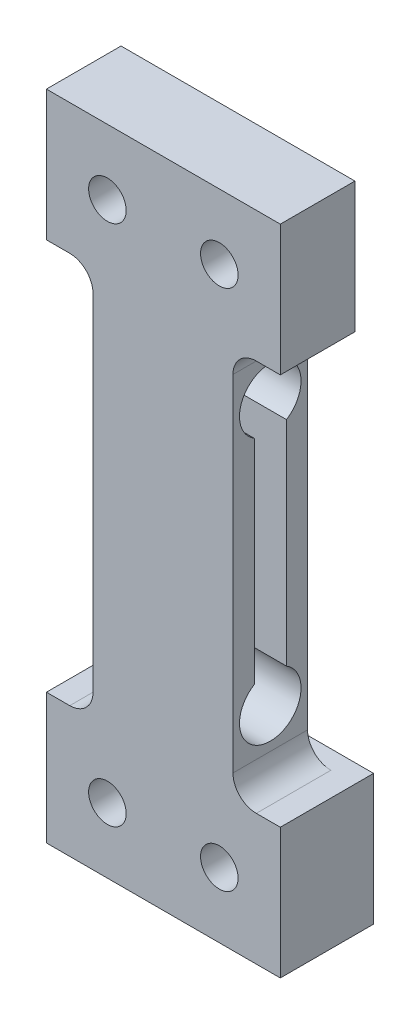
ISO-10303-21;
HEADER;
FILE_DESCRIPTION(('STEP AP214'),'2;1');
FILE_NAME('part.step','',(''),(''),'','','');
FILE_SCHEMA(('AUTOMOTIVE_DESIGN { 1 0 10303 214 1 1 1 1 }'));
ENDSEC;
DATA;
#1=APPLICATION_CONTEXT('core data for automotive mechanical design processes');
#2=APPLICATION_PROTOCOL_DEFINITION('international standard','automotive_design',2000,#1);
#3=PRODUCT_CONTEXT('',#1,'mechanical');
#4=PRODUCT('Part','Part','',(#3));
#5=PRODUCT_RELATED_PRODUCT_CATEGORY('part','',(#4));
#6=PRODUCT_DEFINITION_FORMATION('','',#4);
#7=PRODUCT_DEFINITION_CONTEXT('part definition',#1,'design');
#8=PRODUCT_DEFINITION('design','',#6,#7);
#9=PRODUCT_DEFINITION_SHAPE('','',#8);
#10=(LENGTH_UNIT() NAMED_UNIT(*) SI_UNIT(.MILLI.,.METRE.));
#11=(NAMED_UNIT(*) PLANE_ANGLE_UNIT() SI_UNIT($,.RADIAN.));
#12=(NAMED_UNIT(*) SI_UNIT($,.STERADIAN.) SOLID_ANGLE_UNIT());
#13=UNCERTAINTY_MEASURE_WITH_UNIT(LENGTH_MEASURE(1.E-05),#10,'distance_accuracy_value','');
#14=(GEOMETRIC_REPRESENTATION_CONTEXT(3) GLOBAL_UNCERTAINTY_ASSIGNED_CONTEXT((#13)) GLOBAL_UNIT_ASSIGNED_CONTEXT((#10,
#11,#12)) REPRESENTATION_CONTEXT('',''));
#15=CARTESIAN_POINT('',(0.,0.,0.));
#16=DIRECTION('',(0.,0.,1.));
#17=DIRECTION('',(1.,0.,0.));
#18=AXIS2_PLACEMENT_3D('',#15,#16,#17);
#19=CARTESIAN_POINT('',(-10.,0.,4.));
#20=DIRECTION('',(-1.,0.,0.));
#21=DIRECTION('',(0.,0.,1.));
#22=AXIS2_PLACEMENT_3D('',#19,#20,#21);
#23=PLANE('',#22);
#24=DIRECTION('',(0.,0.,1.));
#25=VECTOR('',#24,1.);
#26=CARTESIAN_POINT('',(-10.,28.,0.));
#27=LINE('',#26,#25);
#28=CARTESIAN_POINT('',(-10.,28.,0.));
#29=VERTEX_POINT('',#28);
#30=CARTESIAN_POINT('',(-10.,28.,4.));
#31=VERTEX_POINT('',#30);
#32=EDGE_CURVE('E269',#29,#31,#27,.T.);
#33=ORIENTED_EDGE('',*,*,#32,.T.);
#34=DIRECTION('',(0.,1.,0.));
#35=VECTOR('',#34,1.);
#36=CARTESIAN_POINT('',(-10.,0.,4.));
#37=LINE('',#36,#35);
#38=CARTESIAN_POINT('',(-10.,35.,4.));
#39=VERTEX_POINT('',#38);
#40=EDGE_CURVE('E301',#31,#39,#37,.T.);
#41=ORIENTED_EDGE('',*,*,#40,.T.);
#42=DIRECTION('',(0.,0.,-1.));
#43=VECTOR('',#42,1.);
#44=CARTESIAN_POINT('',(-10.,35.,4.));
#45=LINE('',#44,#43);
#46=CARTESIAN_POINT('',(-10.,35.,0.));
#47=VERTEX_POINT('',#46);
#48=EDGE_CURVE('E311',#39,#47,#45,.T.);
#49=ORIENTED_EDGE('',*,*,#48,.T.);
#50=DIRECTION('',(0.,1.,0.));
#51=VECTOR('',#50,1.);
#52=CARTESIAN_POINT('',(-10.,0.,0.));
#53=LINE('',#52,#51);
#54=EDGE_CURVE('E295',#29,#47,#53,.T.);
#55=ORIENTED_EDGE('',*,*,#54,.F.);
#56=EDGE_LOOP('',(#33,#41,#49,#55));
#57=FACE_BOUND('',#56,.T.);
#58=ADVANCED_FACE('F38',(#57),#23,.T.);
#59=CARTESIAN_POINT('',(2.53843426704407,35.,4.));
#60=DIRECTION('',(1.,0.,0.));
#61=DIRECTION('',(0.,0.,-1.));
#62=AXIS2_PLACEMENT_3D('',#59,#60,#61);
#63=PLANE('',#62);
#64=DIRECTION('',(0.,0.,1.));
#65=VECTOR('',#64,1.);
#66=CARTESIAN_POINT('',(2.53843426704407,7.,0.));
#67=LINE('',#66,#65);
#68=CARTESIAN_POINT('',(2.53843426704407,7.,-1.));
#69=VERTEX_POINT('',#68);
#70=CARTESIAN_POINT('',(2.53843426704407,7.,4.));
#71=VERTEX_POINT('',#70);
#72=EDGE_CURVE('E288',#69,#71,#67,.T.);
#73=ORIENTED_EDGE('',*,*,#72,.T.);
#74=DIRECTION('',(0.,-1.,0.));
#75=VECTOR('',#74,1.);
#76=CARTESIAN_POINT('',(2.53843426704407,35.,4.));
#77=LINE('',#76,#75);
#78=CARTESIAN_POINT('',(2.53843426704407,0.,4.));
#79=VERTEX_POINT('',#78);
#80=EDGE_CURVE('E183',#71,#79,#77,.T.);
#81=ORIENTED_EDGE('',*,*,#80,.T.);
#82=DIRECTION('',(0.,0.,-1.));
#83=VECTOR('',#82,1.);
#84=CARTESIAN_POINT('',(2.53843426704407,0.,4.));
#85=LINE('',#84,#83);
#86=CARTESIAN_POINT('',(2.53843426704407,0.,-1.));
#87=VERTEX_POINT('',#86);
#88=EDGE_CURVE('E176',#79,#87,#85,.T.);
#89=ORIENTED_EDGE('',*,*,#88,.T.);
#90=DIRECTION('',(0.,-1.,0.));
#91=VECTOR('',#90,1.);
#92=CARTESIAN_POINT('',(2.53843426704407,7.,-1.));
#93=LINE('',#92,#91);
#94=EDGE_CURVE('E181',#69,#87,#93,.T.);
#95=ORIENTED_EDGE('',*,*,#94,.F.);
#96=EDGE_LOOP('',(#73,#81,#89,#95));
#97=FACE_BOUND('',#96,.T.);
#98=ADVANCED_FACE('F179',(#97),#63,.T.);
#99=CARTESIAN_POINT('',(-10.,35.,4.));
#100=DIRECTION('',(0.,1.,0.));
#101=DIRECTION('',(0.,0.,1.));
#102=AXIS2_PLACEMENT_3D('',#99,#100,#101);
#103=PLANE('',#102);
#104=DIRECTION('',(1.,0.,0.));
#105=VECTOR('',#104,1.);
#106=CARTESIAN_POINT('',(-10.,35.,0.));
#107=LINE('',#106,#105);
#108=CARTESIAN_POINT('',(2.53843426704407,35.,0.));
#109=VERTEX_POINT('',#108);
#110=EDGE_CURVE('E290',#47,#109,#107,.T.);
#111=ORIENTED_EDGE('',*,*,#110,.F.);
#112=ORIENTED_EDGE('',*,*,#48,.F.);
#113=DIRECTION('',(1.,0.,0.));
#114=VECTOR('',#113,1.);
#115=CARTESIAN_POINT('',(-10.,35.,4.));
#116=LINE('',#115,#114);
#117=CARTESIAN_POINT('',(2.53843426704407,35.,4.));
#118=VERTEX_POINT('',#117);
#119=EDGE_CURVE('E292',#39,#118,#116,.T.);
#120=ORIENTED_EDGE('',*,*,#119,.T.);
#121=DIRECTION('',(0.,0.,-1.));
#122=VECTOR('',#121,1.);
#123=CARTESIAN_POINT('',(2.53843426704407,35.,4.));
#124=LINE('',#123,#122);
#125=EDGE_CURVE('E188',#118,#109,#124,.T.);
#126=ORIENTED_EDGE('',*,*,#125,.T.);
#127=EDGE_LOOP('',(#111,#112,#120,#126));
#128=FACE_BOUND('',#127,.T.);
#129=ADVANCED_FACE('F407',(#128),#103,.T.);
#130=DIRECTION('',(0.,0.,1.));
#131=VECTOR('',#130,1.);
#132=CARTESIAN_POINT('',(-10.,7.,0.));
#133=LINE('',#132,#131);
#134=CARTESIAN_POINT('',(-10.,7.,-1.));
#135=VERTEX_POINT('',#134);
#136=CARTESIAN_POINT('',(-10.,7.,4.));
#137=VERTEX_POINT('',#136);
#138=EDGE_CURVE('E263',#135,#137,#133,.T.);
#139=ORIENTED_EDGE('',*,*,#138,.F.);
#140=DIRECTION('',(0.,1.,0.));
#141=VECTOR('',#140,1.);
#142=CARTESIAN_POINT('',(-10.,7.,-1.));
#143=LINE('',#142,#141);
#144=CARTESIAN_POINT('',(-10.,0.,-1.));
#145=VERTEX_POINT('',#144);
#146=EDGE_CURVE('E196',#145,#135,#143,.T.);
#147=ORIENTED_EDGE('',*,*,#146,.F.);
#148=DIRECTION('',(0.,0.,-1.));
#149=VECTOR('',#148,1.);
#150=CARTESIAN_POINT('',(-10.,0.,4.));
#151=LINE('',#150,#149);
#152=CARTESIAN_POINT('',(-10.,0.,4.));
#153=VERTEX_POINT('',#152);
#154=EDGE_CURVE('E187',#153,#145,#151,.T.);
#155=ORIENTED_EDGE('',*,*,#154,.F.);
#156=EDGE_CURVE('E302',#153,#137,#37,.T.);
#157=ORIENTED_EDGE('',*,*,#156,.T.);
#158=EDGE_LOOP('',(#139,#147,#155,#157));
#159=FACE_BOUND('',#158,.T.);
#160=ADVANCED_FACE('F379',(#159),#23,.T.);
#161=CARTESIAN_POINT('',(2.53843426704407,0.,4.));
#162=DIRECTION('',(0.,-1.,0.));
#163=DIRECTION('',(1.,0.,0.));
#164=AXIS2_PLACEMENT_3D('',#161,#162,#163);
#165=PLANE('',#164);
#166=ORIENTED_EDGE('',*,*,#154,.T.);
#167=DIRECTION('',(-1.,0.,0.));
#168=VECTOR('',#167,1.);
#169=CARTESIAN_POINT('',(2.53843426704407,0.,-1.));
#170=LINE('',#169,#168);
#171=EDGE_CURVE('E191',#87,#145,#170,.T.);
#172=ORIENTED_EDGE('',*,*,#171,.F.);
#173=ORIENTED_EDGE('',*,*,#88,.F.);
#174=DIRECTION('',(-1.,0.,0.));
#175=VECTOR('',#174,1.);
#176=CARTESIAN_POINT('',(2.53843426704407,0.,4.));
#177=LINE('',#176,#175);
#178=EDGE_CURVE('E299',#79,#153,#177,.T.);
#179=ORIENTED_EDGE('',*,*,#178,.T.);
#180=EDGE_LOOP('',(#166,#172,#173,#179));
#181=FACE_BOUND('',#180,.T.);
#182=ADVANCED_FACE('F192',(#181),#165,.T.);
#183=DIRECTION('',(0.,0.,1.));
#184=VECTOR('',#183,1.);
#185=CARTESIAN_POINT('',(2.53843426704407,28.,0.));
#186=LINE('',#185,#184);
#187=CARTESIAN_POINT('',(2.53843426704407,28.,0.));
#188=VERTEX_POINT('',#187);
#189=CARTESIAN_POINT('',(2.53843426704407,28.,4.));
#190=VERTEX_POINT('',#189);
#191=EDGE_CURVE('E281',#188,#190,#186,.T.);
#192=ORIENTED_EDGE('',*,*,#191,.F.);
#193=DIRECTION('',(0.,-1.,0.));
#194=VECTOR('',#193,1.);
#195=CARTESIAN_POINT('',(2.53843426704407,35.,0.));
#196=LINE('',#195,#194);
#197=EDGE_CURVE('E307',#109,#188,#196,.T.);
#198=ORIENTED_EDGE('',*,*,#197,.F.);
#199=ORIENTED_EDGE('',*,*,#125,.F.);
#200=EDGE_CURVE('E296',#118,#190,#77,.T.);
#201=ORIENTED_EDGE('',*,*,#200,.T.);
#202=EDGE_LOOP('',(#192,#198,#199,#201));
#203=FACE_BOUND('',#202,.T.);
#204=ADVANCED_FACE('F402',(#203),#63,.T.);
#205=CARTESIAN_POINT('',(0.,0.,4.));
#206=DIRECTION('',(0.,0.,-1.));
#207=DIRECTION('',(-1.,0.,0.));
#208=AXIS2_PLACEMENT_3D('',#205,#206,#207);
#209=PLANE('',#208);
#210=CARTESIAN_POINT('',(-0.730782866478019,3.49999999999998,4.));
#211=DIRECTION('',(0.,0.,-1.));
#212=DIRECTION('',(-1.,0.,0.));
#213=AXIS2_PLACEMENT_3D('',#210,#211,#212);
#214=CIRCLE('',#213,1.00650000000001);
#215=CARTESIAN_POINT('',(-1.73728286647803,3.49999999999998,4.));
#216=VERTEX_POINT('',#215);
#217=EDGE_CURVE('E210',#216,#216,#214,.T.);
#218=ORIENTED_EDGE('',*,*,#217,.T.);
#219=EDGE_LOOP('',(#218));
#220=FACE_BOUND('',#219,.T.);
#221=CARTESIAN_POINT('',(-6.73078286647802,3.5,4.));
#222=DIRECTION('',(0.,0.,-1.));
#223=DIRECTION('',(-1.,0.,0.));
#224=AXIS2_PLACEMENT_3D('',#221,#222,#223);
#225=CIRCLE('',#224,1.00650000000001);
#226=CARTESIAN_POINT('',(-7.73728286647803,3.5,4.));
#227=VERTEX_POINT('',#226);
#228=EDGE_CURVE('E213',#227,#227,#225,.T.);
#229=ORIENTED_EDGE('',*,*,#228,.T.);
#230=EDGE_LOOP('',(#229));
#231=FACE_BOUND('',#230,.T.);
#232=CARTESIAN_POINT('',(-0.730782866478016,31.5,4.));
#233=DIRECTION('',(0.,0.,-1.));
#234=DIRECTION('',(-1.,0.,0.));
#235=AXIS2_PLACEMENT_3D('',#232,#233,#234);
#236=CIRCLE('',#235,1.00650000000001);
#237=CARTESIAN_POINT('',(-1.73728286647803,31.5,4.));
#238=VERTEX_POINT('',#237);
#239=EDGE_CURVE('E221',#238,#238,#236,.T.);
#240=ORIENTED_EDGE('',*,*,#239,.T.);
#241=EDGE_LOOP('',(#240));
#242=FACE_BOUND('',#241,.T.);
#243=CARTESIAN_POINT('',(-6.73078286647802,31.5,4.));
#244=DIRECTION('',(0.,0.,-1.));
#245=DIRECTION('',(-1.,0.,0.));
#246=AXIS2_PLACEMENT_3D('',#243,#244,#245);
#247=CIRCLE('',#246,1.00650000000001);
#248=CARTESIAN_POINT('',(-7.73728286647803,31.5,4.));
#249=VERTEX_POINT('',#248);
#250=EDGE_CURVE('E227',#249,#249,#247,.T.);
#251=ORIENTED_EDGE('',*,*,#250,.T.);
#252=EDGE_LOOP('',(#251));
#253=FACE_BOUND('',#252,.T.);
#254=ORIENTED_EDGE('',*,*,#40,.F.);
#255=DIRECTION('',(-1.,0.,0.));
#256=VECTOR('',#255,1.);
#257=CARTESIAN_POINT('',(-7.5,28.,4.));
#258=LINE('',#257,#256);
#259=CARTESIAN_POINT('',(-8.74999999999999,28.,4.));
#260=VERTEX_POINT('',#259);
#261=EDGE_CURVE('E261',#260,#31,#258,.T.);
#262=ORIENTED_EDGE('',*,*,#261,.F.);
#263=CARTESIAN_POINT('',(-8.75,26.75,4.));
#264=DIRECTION('',(0.,0.,-1.));
#265=DIRECTION('',(-1.,0.,0.));
#266=AXIS2_PLACEMENT_3D('',#263,#264,#265);
#267=CIRCLE('',#266,1.25);
#268=CARTESIAN_POINT('',(-7.5,26.75,4.));
#269=VERTEX_POINT('',#268);
#270=EDGE_CURVE('E346',#260,#269,#267,.T.);
#271=ORIENTED_EDGE('',*,*,#270,.T.);
#272=DIRECTION('',(0.,1.,0.));
#273=VECTOR('',#272,1.);
#274=CARTESIAN_POINT('',(-7.5,6.99999999999999,4.));
#275=LINE('',#274,#273);
#276=CARTESIAN_POINT('',(-7.5,8.24999999999999,4.));
#277=VERTEX_POINT('',#276);
#278=EDGE_CURVE('E265',#277,#269,#275,.T.);
#279=ORIENTED_EDGE('',*,*,#278,.F.);
#280=CARTESIAN_POINT('',(-8.75,8.24999999999999,4.));
#281=DIRECTION('',(0.,0.,-1.));
#282=DIRECTION('',(-1.,0.,0.));
#283=AXIS2_PLACEMENT_3D('',#280,#281,#282);
#284=CIRCLE('',#283,1.25);
#285=CARTESIAN_POINT('',(-8.75000000000001,6.99999999999999,4.));
#286=VERTEX_POINT('',#285);
#287=EDGE_CURVE('E61',#277,#286,#284,.T.);
#288=ORIENTED_EDGE('',*,*,#287,.T.);
#289=DIRECTION('',(1.,0.,0.));
#290=VECTOR('',#289,1.);
#291=CARTESIAN_POINT('',(-10.,7.,4.));
#292=LINE('',#291,#290);
#293=EDGE_CURVE('E249',#137,#286,#292,.T.);
#294=ORIENTED_EDGE('',*,*,#293,.F.);
#295=ORIENTED_EDGE('',*,*,#156,.F.);
#296=ORIENTED_EDGE('',*,*,#178,.F.);
#297=ORIENTED_EDGE('',*,*,#80,.F.);
#298=DIRECTION('',(1.,0.,0.));
#299=VECTOR('',#298,1.);
#300=CARTESIAN_POINT('',(0.,6.99999999999999,4.));
#301=LINE('',#300,#299);
#302=CARTESIAN_POINT('',(1.25,7.,4.));
#303=VERTEX_POINT('',#302);
#304=EDGE_CURVE('E278',#303,#71,#301,.T.);
#305=ORIENTED_EDGE('',*,*,#304,.F.);
#306=CARTESIAN_POINT('',(1.25,8.25,4.));
#307=DIRECTION('',(0.,0.,-1.));
#308=DIRECTION('',(-1.,0.,0.));
#309=AXIS2_PLACEMENT_3D('',#306,#307,#308);
#310=CIRCLE('',#309,1.25);
#311=CARTESIAN_POINT('',(0.,8.25,4.));
#312=VERTEX_POINT('',#311);
#313=EDGE_CURVE('E343',#303,#312,#310,.T.);
#314=ORIENTED_EDGE('',*,*,#313,.T.);
#315=DIRECTION('',(0.,-1.,0.));
#316=VECTOR('',#315,1.);
#317=CARTESIAN_POINT('',(0.,28.,4.));
#318=LINE('',#317,#316);
#319=CARTESIAN_POINT('',(0.,26.75,4.));
#320=VERTEX_POINT('',#319);
#321=EDGE_CURVE('E284',#320,#312,#318,.T.);
#322=ORIENTED_EDGE('',*,*,#321,.F.);
#323=CARTESIAN_POINT('',(1.25,26.75,4.));
#324=DIRECTION('',(0.,0.,-1.));
#325=DIRECTION('',(-1.,0.,0.));
#326=AXIS2_PLACEMENT_3D('',#323,#324,#325);
#327=CIRCLE('',#326,1.25);
#328=CARTESIAN_POINT('',(1.25,28.,4.));
#329=VERTEX_POINT('',#328);
#330=EDGE_CURVE('E339',#320,#329,#327,.T.);
#331=ORIENTED_EDGE('',*,*,#330,.T.);
#332=DIRECTION('',(-1.,0.,0.));
#333=VECTOR('',#332,1.);
#334=CARTESIAN_POINT('',(2.53843426704407,28.,4.));
#335=LINE('',#334,#333);
#336=EDGE_CURVE('E272',#190,#329,#335,.T.);
#337=ORIENTED_EDGE('',*,*,#336,.F.);
#338=ORIENTED_EDGE('',*,*,#200,.F.);
#339=ORIENTED_EDGE('',*,*,#119,.F.);
#340=EDGE_LOOP('',(#254,#262,#271,#279,#288,#294,#295,#296,#297,#305,#314,#322,#331,#337,#338,#339));
#341=FACE_BOUND('',#340,.T.);
#342=ADVANCED_FACE('F377',(#220,#231,#242,#253,#341),#209,.F.);
#343=CARTESIAN_POINT('',(0.,0.,0.));
#344=DIRECTION('',(0.,0.,-1.));
#345=DIRECTION('',(-1.,0.,0.));
#346=AXIS2_PLACEMENT_3D('',#343,#344,#345);
#347=PLANE('',#346);
#348=DIRECTION('',(1.,0.,0.));
#349=VECTOR('',#348,1.);
#350=CARTESIAN_POINT('',(2.53843426704407,7.,0.));
#351=LINE('',#350,#349);
#352=CARTESIAN_POINT('',(-8.75000000000001,6.99999999999999,0.));
#353=VERTEX_POINT('',#352);
#354=CARTESIAN_POINT('',(1.25,7.,0.));
#355=VERTEX_POINT('',#354);
#356=EDGE_CURVE('E11',#353,#355,#351,.T.);
#357=ORIENTED_EDGE('',*,*,#356,.F.);
#358=CARTESIAN_POINT('',(-8.75,8.24999999999999,0.));
#359=DIRECTION('',(0.,0.,-1.));
#360=DIRECTION('',(-1.,0.,0.));
#361=AXIS2_PLACEMENT_3D('',#358,#359,#360);
#362=CIRCLE('',#361,1.25);
#363=CARTESIAN_POINT('',(-7.5,8.24999999999999,0.));
#364=VERTEX_POINT('',#363);
#365=EDGE_CURVE('E47',#353,#364,#362,.F.);
#366=ORIENTED_EDGE('',*,*,#365,.T.);
#367=DIRECTION('',(0.,1.,0.));
#368=VECTOR('',#367,1.);
#369=CARTESIAN_POINT('',(-7.5,6.99999999999999,0.));
#370=LINE('',#369,#368);
#371=CARTESIAN_POINT('',(-7.5,26.75,0.));
#372=VERTEX_POINT('',#371);
#373=EDGE_CURVE('E257',#364,#372,#370,.T.);
#374=ORIENTED_EDGE('',*,*,#373,.T.);
#375=CARTESIAN_POINT('',(-8.75,26.75,0.));
#376=DIRECTION('',(0.,0.,-1.));
#377=DIRECTION('',(-1.,0.,0.));
#378=AXIS2_PLACEMENT_3D('',#375,#376,#377);
#379=CIRCLE('',#378,1.25);
#380=CARTESIAN_POINT('',(-8.74999999999999,28.,0.));
#381=VERTEX_POINT('',#380);
#382=EDGE_CURVE('E348',#372,#381,#379,.F.);
#383=ORIENTED_EDGE('',*,*,#382,.T.);
#384=DIRECTION('',(-1.,0.,0.));
#385=VECTOR('',#384,1.);
#386=CARTESIAN_POINT('',(-7.5,28.,0.));
#387=LINE('',#386,#385);
#388=EDGE_CURVE('E260',#381,#29,#387,.T.);
#389=ORIENTED_EDGE('',*,*,#388,.T.);
#390=ORIENTED_EDGE('',*,*,#54,.T.);
#391=ORIENTED_EDGE('',*,*,#110,.T.);
#392=ORIENTED_EDGE('',*,*,#197,.T.);
#393=DIRECTION('',(-1.,0.,0.));
#394=VECTOR('',#393,1.);
#395=CARTESIAN_POINT('',(2.53843426704407,28.,0.));
#396=LINE('',#395,#394);
#397=CARTESIAN_POINT('',(1.25,28.,0.));
#398=VERTEX_POINT('',#397);
#399=EDGE_CURVE('E274',#188,#398,#396,.T.);
#400=ORIENTED_EDGE('',*,*,#399,.T.);
#401=CARTESIAN_POINT('',(1.25,26.75,0.));
#402=DIRECTION('',(0.,0.,-1.));
#403=DIRECTION('',(-1.,0.,0.));
#404=AXIS2_PLACEMENT_3D('',#401,#402,#403);
#405=CIRCLE('',#404,1.25);
#406=CARTESIAN_POINT('',(0.,26.75,0.));
#407=VERTEX_POINT('',#406);
#408=EDGE_CURVE('E341',#398,#407,#405,.F.);
#409=ORIENTED_EDGE('',*,*,#408,.T.);
#410=DIRECTION('',(0.,-1.,0.));
#411=VECTOR('',#410,1.);
#412=CARTESIAN_POINT('',(0.,28.,0.));
#413=LINE('',#412,#411);
#414=CARTESIAN_POINT('',(0.,8.25,0.));
#415=VERTEX_POINT('',#414);
#416=EDGE_CURVE('E277',#407,#415,#413,.T.);
#417=ORIENTED_EDGE('',*,*,#416,.T.);
#418=CARTESIAN_POINT('',(1.25,8.25,0.));
#419=DIRECTION('',(0.,0.,-1.));
#420=DIRECTION('',(-1.,0.,0.));
#421=AXIS2_PLACEMENT_3D('',#418,#419,#420);
#422=CIRCLE('',#421,1.25);
#423=EDGE_CURVE('E345',#415,#355,#422,.F.);
#424=ORIENTED_EDGE('',*,*,#423,.T.);
#425=EDGE_LOOP('',(#357,#366,#374,#383,#389,#390,#391,#392,#400,#409,#417,#424));
#426=FACE_BOUND('',#425,.T.);
#427=CARTESIAN_POINT('',(-0.730782866478016,31.5,0.));
#428=DIRECTION('',(0.,0.,-1.));
#429=DIRECTION('',(-1.,0.,0.));
#430=AXIS2_PLACEMENT_3D('',#427,#428,#429);
#431=CIRCLE('',#430,1.00650000000001);
#432=CARTESIAN_POINT('',(-1.73728286647803,31.5,0.));
#433=VERTEX_POINT('',#432);
#434=EDGE_CURVE('E218',#433,#433,#431,.T.);
#435=ORIENTED_EDGE('',*,*,#434,.F.);
#436=EDGE_LOOP('',(#435));
#437=FACE_BOUND('',#436,.T.);
#438=CARTESIAN_POINT('',(-6.73078286647802,31.5,0.));
#439=DIRECTION('',(0.,0.,-1.));
#440=DIRECTION('',(-1.,0.,0.));
#441=AXIS2_PLACEMENT_3D('',#438,#439,#440);
#442=CIRCLE('',#441,1.00650000000001);
#443=CARTESIAN_POINT('',(-7.73728286647803,31.5,0.));
#444=VERTEX_POINT('',#443);
#445=EDGE_CURVE('E224',#444,#444,#442,.T.);
#446=ORIENTED_EDGE('',*,*,#445,.F.);
#447=EDGE_LOOP('',(#446));
#448=FACE_BOUND('',#447,.T.);
#449=ADVANCED_FACE('F364',(#426,#437,#448),#347,.T.);
#450=CARTESIAN_POINT('',(0.,6.99999999999999,0.));
#451=DIRECTION('',(0.,-1.,0.));
#452=DIRECTION('',(1.,0.,0.));
#453=AXIS2_PLACEMENT_3D('',#450,#451,#452);
#454=PLANE('',#453);
#455=ORIENTED_EDGE('',*,*,#72,.F.);
#456=DIRECTION('',(1.,0.,0.));
#457=VECTOR('',#456,1.);
#458=CARTESIAN_POINT('',(2.53843426704407,7.,-1.));
#459=LINE('',#458,#457);
#460=EDGE_CURVE('E201',#135,#69,#459,.T.);
#461=ORIENTED_EDGE('',*,*,#460,.F.);
#462=ORIENTED_EDGE('',*,*,#138,.T.);
#463=ORIENTED_EDGE('',*,*,#293,.T.);
#464=DIRECTION('',(0.,0.,1.));
#465=VECTOR('',#464,1.);
#466=CARTESIAN_POINT('',(-8.75000000000001,6.99999999999999,0.));
#467=LINE('',#466,#465);
#468=EDGE_CURVE('E338',#286,#353,#467,.F.);
#469=ORIENTED_EDGE('',*,*,#468,.T.);
#470=ORIENTED_EDGE('',*,*,#356,.T.);
#471=DIRECTION('',(0.,0.,1.));
#472=VECTOR('',#471,1.);
#473=CARTESIAN_POINT('',(1.25,7.,4.));
#474=LINE('',#473,#472);
#475=EDGE_CURVE('E329',#355,#303,#474,.T.);
#476=ORIENTED_EDGE('',*,*,#475,.T.);
#477=ORIENTED_EDGE('',*,*,#304,.T.);
#478=EDGE_LOOP('',(#455,#461,#462,#463,#469,#470,#476,#477));
#479=FACE_BOUND('',#478,.T.);
#480=ADVANCED_FACE('F374',(#479),#454,.F.);
#481=CARTESIAN_POINT('',(0.,28.,0.));
#482=DIRECTION('',(-1.,0.,0.));
#483=DIRECTION('',(0.,-1.,0.));
#484=AXIS2_PLACEMENT_3D('',#481,#482,#483);
#485=PLANE('',#484);
#486=DIRECTION('',(0.,-1.,0.));
#487=VECTOR('',#486,1.);
#488=CARTESIAN_POINT('',(0.,23.2143698595176,2.85593376306962));
#489=LINE('',#488,#487);
#490=CARTESIAN_POINT('',(0.,23.2143698595176,2.85593376306962));
#491=VERTEX_POINT('',#490);
#492=CARTESIAN_POINT('',(0.,11.7856301404824,2.85593376306961));
#493=VERTEX_POINT('',#492);
#494=EDGE_CURVE('E240',#491,#493,#489,.T.);
#495=ORIENTED_EDGE('',*,*,#494,.F.);
#496=CARTESIAN_POINT('',(0.,24.625,2.));
#497=DIRECTION('',(1.,0.,0.));
#498=DIRECTION('',(0.,0.,-1.));
#499=AXIS2_PLACEMENT_3D('',#496,#497,#498);
#500=CIRCLE('',#499,1.65);
#501=CARTESIAN_POINT('',(0.,23.2218673192958,1.13183026985506));
#502=VERTEX_POINT('',#501);
#503=EDGE_CURVE('E230',#502,#491,#500,.T.);
#504=ORIENTED_EDGE('',*,*,#503,.F.);
#505=DIRECTION('',(0.,1.,0.));
#506=VECTOR('',#505,1.);
#507=CARTESIAN_POINT('',(0.,11.7781326807042,1.13183026985508));
#508=LINE('',#507,#506);
#509=CARTESIAN_POINT('',(0.,11.7781326807042,1.13183026985507));
#510=VERTEX_POINT('',#509);
#511=EDGE_CURVE('E243',#510,#502,#508,.T.);
#512=ORIENTED_EDGE('',*,*,#511,.F.);
#513=CARTESIAN_POINT('',(0.,10.375,2.));
#514=DIRECTION('',(1.,0.,0.));
#515=DIRECTION('',(0.,1.,0.));
#516=AXIS2_PLACEMENT_3D('',#513,#514,#515);
#517=CIRCLE('',#516,1.64999999999998);
#518=EDGE_CURVE('E235',#493,#510,#517,.T.);
#519=ORIENTED_EDGE('',*,*,#518,.F.);
#520=EDGE_LOOP('',(#495,#504,#512,#519));
#521=FACE_BOUND('',#520,.T.);
#522=ORIENTED_EDGE('',*,*,#416,.F.);
#523=DIRECTION('',(0.,0.,1.));
#524=VECTOR('',#523,1.);
#525=CARTESIAN_POINT('',(0.,26.75,4.));
#526=LINE('',#525,#524);
#527=EDGE_CURVE('E324',#407,#320,#526,.T.);
#528=ORIENTED_EDGE('',*,*,#527,.T.);
#529=ORIENTED_EDGE('',*,*,#321,.T.);
#530=DIRECTION('',(0.,0.,1.));
#531=VECTOR('',#530,1.);
#532=CARTESIAN_POINT('',(0.,8.25,0.));
#533=LINE('',#532,#531);
#534=EDGE_CURVE('E322',#312,#415,#533,.F.);
#535=ORIENTED_EDGE('',*,*,#534,.T.);
#536=EDGE_LOOP('',(#522,#528,#529,#535));
#537=FACE_BOUND('',#536,.T.);
#538=ADVANCED_FACE('F389',(#521,#537),#485,.F.);
#539=CARTESIAN_POINT('',(2.53843426704407,28.,0.));
#540=DIRECTION('',(0.,1.,0.));
#541=DIRECTION('',(-1.,0.,0.));
#542=AXIS2_PLACEMENT_3D('',#539,#540,#541);
#543=PLANE('',#542);
#544=ORIENTED_EDGE('',*,*,#336,.T.);
#545=DIRECTION('',(0.,0.,1.));
#546=VECTOR('',#545,1.);
#547=CARTESIAN_POINT('',(1.24999999999999,28.,0.));
#548=LINE('',#547,#546);
#549=EDGE_CURVE('E327',#329,#398,#548,.F.);
#550=ORIENTED_EDGE('',*,*,#549,.T.);
#551=ORIENTED_EDGE('',*,*,#399,.F.);
#552=ORIENTED_EDGE('',*,*,#191,.T.);
#553=EDGE_LOOP('',(#544,#550,#551,#552));
#554=FACE_BOUND('',#553,.T.);
#555=ADVANCED_FACE('F398',(#554),#543,.F.);
#556=CARTESIAN_POINT('',(-7.5,28.,0.));
#557=DIRECTION('',(0.,1.,0.));
#558=DIRECTION('',(-1.,0.,0.));
#559=AXIS2_PLACEMENT_3D('',#556,#557,#558);
#560=PLANE('',#559);
#561=ORIENTED_EDGE('',*,*,#388,.F.);
#562=DIRECTION('',(0.,0.,1.));
#563=VECTOR('',#562,1.);
#564=CARTESIAN_POINT('',(-8.74999999999999,28.,4.));
#565=LINE('',#564,#563);
#566=EDGE_CURVE('E330',#381,#260,#565,.T.);
#567=ORIENTED_EDGE('',*,*,#566,.T.);
#568=ORIENTED_EDGE('',*,*,#261,.T.);
#569=ORIENTED_EDGE('',*,*,#32,.F.);
#570=EDGE_LOOP('',(#561,#567,#568,#569));
#571=FACE_BOUND('',#570,.T.);
#572=ADVANCED_FACE('F414',(#571),#560,.F.);
#573=CARTESIAN_POINT('',(-7.5,6.99999999999999,0.));
#574=DIRECTION('',(1.,0.,0.));
#575=DIRECTION('',(0.,1.,0.));
#576=AXIS2_PLACEMENT_3D('',#573,#574,#575);
#577=PLANE('',#576);
#578=DIRECTION('',(0.,1.,0.));
#579=VECTOR('',#578,1.);
#580=CARTESIAN_POINT('',(-7.5,6.99999999999999,1.13183026985508));
#581=LINE('',#580,#579);
#582=CARTESIAN_POINT('',(-7.5,11.7781326807042,1.13183026985507));
#583=VERTEX_POINT('',#582);
#584=CARTESIAN_POINT('',(-7.5,23.2218673192959,1.13183026985506));
#585=VERTEX_POINT('',#584);
#586=EDGE_CURVE('E319',#583,#585,#581,.T.);
#587=ORIENTED_EDGE('',*,*,#586,.T.);
#588=CARTESIAN_POINT('',(-7.5,24.625,2.));
#589=DIRECTION('',(1.,0.,0.));
#590=DIRECTION('',(0.,0.,-1.));
#591=AXIS2_PLACEMENT_3D('',#588,#589,#590);
#592=CIRCLE('',#591,1.64999999999999);
#593=CARTESIAN_POINT('',(-7.5,23.2143698595176,2.85593376306962));
#594=VERTEX_POINT('',#593);
#595=EDGE_CURVE('E232',#585,#594,#592,.T.);
#596=ORIENTED_EDGE('',*,*,#595,.T.);
#597=DIRECTION('',(0.,-1.,0.));
#598=VECTOR('',#597,1.);
#599=CARTESIAN_POINT('',(-7.5,6.99999999999998,2.85593376306961));
#600=LINE('',#599,#598);
#601=CARTESIAN_POINT('',(-7.5,11.7856301404824,2.85593376306961));
#602=VERTEX_POINT('',#601);
#603=EDGE_CURVE('E314',#594,#602,#600,.T.);
#604=ORIENTED_EDGE('',*,*,#603,.T.);
#605=CARTESIAN_POINT('',(-7.5,10.375,2.));
#606=DIRECTION('',(1.,0.,0.));
#607=DIRECTION('',(0.,1.,0.));
#608=AXIS2_PLACEMENT_3D('',#605,#606,#607);
#609=CIRCLE('',#608,1.64999999999999);
#610=EDGE_CURVE('E237',#602,#583,#609,.T.);
#611=ORIENTED_EDGE('',*,*,#610,.T.);
#612=EDGE_LOOP('',(#587,#596,#604,#611));
#613=FACE_BOUND('',#612,.T.);
#614=ORIENTED_EDGE('',*,*,#278,.T.);
#615=DIRECTION('',(0.,0.,1.));
#616=VECTOR('',#615,1.);
#617=CARTESIAN_POINT('',(-7.5,26.75,0.));
#618=LINE('',#617,#616);
#619=EDGE_CURVE('E336',#269,#372,#618,.F.);
#620=ORIENTED_EDGE('',*,*,#619,.T.);
#621=ORIENTED_EDGE('',*,*,#373,.F.);
#622=DIRECTION('',(0.,0.,1.));
#623=VECTOR('',#622,1.);
#624=CARTESIAN_POINT('',(-7.5,8.24999999999999,4.));
#625=LINE('',#624,#623);
#626=EDGE_CURVE('E333',#364,#277,#625,.T.);
#627=ORIENTED_EDGE('',*,*,#626,.T.);
#628=EDGE_LOOP('',(#614,#620,#621,#627));
#629=FACE_BOUND('',#628,.T.);
#630=ADVANCED_FACE('F371',(#613,#629),#577,.F.);
#631=CARTESIAN_POINT('',(-10.,11.7781326807042,1.13183026985508));
#632=DIRECTION('',(0.,0.,-1.));
#633=DIRECTION('',(0.,1.,0.));
#634=AXIS2_PLACEMENT_3D('',#631,#632,#633);
#635=PLANE('',#634);
#636=DIRECTION('',(1.,0.,0.));
#637=VECTOR('',#636,1.);
#638=CARTESIAN_POINT('',(-10.,11.7781326807042,1.13183026985508));
#639=LINE('',#638,#637);
#640=EDGE_CURVE('E250',#583,#510,#639,.T.);
#641=ORIENTED_EDGE('',*,*,#640,.T.);
#642=ORIENTED_EDGE('',*,*,#511,.T.);
#643=DIRECTION('',(1.,0.,0.));
#644=VECTOR('',#643,1.);
#645=CARTESIAN_POINT('',(-10.,23.2218673192958,1.13183026985506));
#646=LINE('',#645,#644);
#647=EDGE_CURVE('E247',#585,#502,#646,.T.);
#648=ORIENTED_EDGE('',*,*,#647,.F.);
#649=ORIENTED_EDGE('',*,*,#586,.F.);
#650=EDGE_LOOP('',(#641,#642,#648,#649));
#651=FACE_BOUND('',#650,.T.);
#652=ADVANCED_FACE('F477',(#651),#635,.F.);
#653=CARTESIAN_POINT('',(-10.,23.2143698595176,2.85593376306962));
#654=DIRECTION('',(0.,0.,1.));
#655=DIRECTION('',(0.,-1.,0.));
#656=AXIS2_PLACEMENT_3D('',#653,#654,#655);
#657=PLANE('',#656);
#658=DIRECTION('',(1.,0.,0.));
#659=VECTOR('',#658,1.);
#660=CARTESIAN_POINT('',(-10.,23.2143698595176,2.85593376306962));
#661=LINE('',#660,#659);
#662=EDGE_CURVE('E246',#594,#491,#661,.T.);
#663=ORIENTED_EDGE('',*,*,#662,.T.);
#664=ORIENTED_EDGE('',*,*,#494,.T.);
#665=DIRECTION('',(1.,0.,0.));
#666=VECTOR('',#665,1.);
#667=CARTESIAN_POINT('',(-10.,11.7856301404824,2.85593376306961));
#668=LINE('',#667,#666);
#669=EDGE_CURVE('E253',#602,#493,#668,.T.);
#670=ORIENTED_EDGE('',*,*,#669,.F.);
#671=ORIENTED_EDGE('',*,*,#603,.F.);
#672=EDGE_LOOP('',(#663,#664,#670,#671));
#673=FACE_BOUND('',#672,.T.);
#674=ADVANCED_FACE('F475',(#673),#657,.F.);
#675=CARTESIAN_POINT('',(-7.5,10.375,2.));
#676=DIRECTION('',(1.,0.,0.));
#677=DIRECTION('',(0.,1.,0.));
#678=AXIS2_PLACEMENT_3D('',#675,#676,#677);
#679=CYLINDRICAL_SURFACE('',#678,1.64999999999999);
#680=ORIENTED_EDGE('',*,*,#610,.F.);
#681=ORIENTED_EDGE('',*,*,#669,.T.);
#682=ORIENTED_EDGE('',*,*,#518,.T.);
#683=ORIENTED_EDGE('',*,*,#640,.F.);
#684=EDGE_LOOP('',(#680,#681,#682,#683));
#685=FACE_BOUND('',#684,.T.);
#686=ADVANCED_FACE('F471',(#685),#679,.F.);
#687=CARTESIAN_POINT('',(-7.5,24.625,2.));
#688=DIRECTION('',(1.,0.,0.));
#689=DIRECTION('',(0.,0.,-1.));
#690=AXIS2_PLACEMENT_3D('',#687,#688,#689);
#691=CYLINDRICAL_SURFACE('',#690,1.65);
#692=ORIENTED_EDGE('',*,*,#503,.T.);
#693=ORIENTED_EDGE('',*,*,#662,.F.);
#694=ORIENTED_EDGE('',*,*,#595,.F.);
#695=ORIENTED_EDGE('',*,*,#647,.T.);
#696=EDGE_LOOP('',(#692,#693,#694,#695));
#697=FACE_BOUND('',#696,.T.);
#698=ADVANCED_FACE('F467',(#697),#691,.F.);
#699=CARTESIAN_POINT('',(-6.73078286647802,31.5,0.));
#700=DIRECTION('',(0.,0.,-1.));
#701=DIRECTION('',(-1.,0.,0.));
#702=AXIS2_PLACEMENT_3D('',#699,#700,#701);
#703=CYLINDRICAL_SURFACE('',#702,1.00650000000001);
#704=ORIENTED_EDGE('',*,*,#250,.F.);
#705=EDGE_LOOP('',(#704));
#706=FACE_BOUND('',#705,.T.);
#707=ORIENTED_EDGE('',*,*,#445,.T.);
#708=EDGE_LOOP('',(#707));
#709=FACE_BOUND('',#708,.T.);
#710=ADVANCED_FACE('F463',(#706,#709),#703,.F.);
#711=CARTESIAN_POINT('',(-0.730782866478016,31.5,0.));
#712=DIRECTION('',(0.,0.,-1.));
#713=DIRECTION('',(-1.,0.,0.));
#714=AXIS2_PLACEMENT_3D('',#711,#712,#713);
#715=CYLINDRICAL_SURFACE('',#714,1.00650000000001);
#716=ORIENTED_EDGE('',*,*,#239,.F.);
#717=EDGE_LOOP('',(#716));
#718=FACE_BOUND('',#717,.T.);
#719=ORIENTED_EDGE('',*,*,#434,.T.);
#720=EDGE_LOOP('',(#719));
#721=FACE_BOUND('',#720,.T.);
#722=ADVANCED_FACE('F452',(#718,#721),#715,.F.);
#723=CARTESIAN_POINT('',(-6.73078286647802,3.5,0.));
#724=DIRECTION('',(0.,0.,-1.));
#725=DIRECTION('',(-1.,0.,0.));
#726=AXIS2_PLACEMENT_3D('',#723,#724,#725);
#727=CYLINDRICAL_SURFACE('',#726,1.00650000000001);
#728=ORIENTED_EDGE('',*,*,#228,.F.);
#729=EDGE_LOOP('',(#728));
#730=FACE_BOUND('',#729,.T.);
#731=CARTESIAN_POINT('',(-6.73078286647802,3.5,0.));
#732=DIRECTION('',(0.,0.,-1.));
#733=DIRECTION('',(-1.,0.,0.));
#734=AXIS2_PLACEMENT_3D('',#731,#732,#733);
#735=CIRCLE('',#734,1.00650000000001);
#736=CARTESIAN_POINT('',(-7.73728286647803,3.5,0.));
#737=VERTEX_POINT('',#736);
#738=EDGE_CURVE('E206',#737,#737,#735,.T.);
#739=ORIENTED_EDGE('',*,*,#738,.T.);
#740=EDGE_LOOP('',(#739));
#741=FACE_BOUND('',#740,.T.);
#742=ADVANCED_FACE('F446',(#730,#741),#727,.F.);
#743=CARTESIAN_POINT('',(-0.730782866478019,3.49999999999998,0.));
#744=DIRECTION('',(0.,0.,-1.));
#745=DIRECTION('',(-1.,0.,0.));
#746=AXIS2_PLACEMENT_3D('',#743,#744,#745);
#747=CYLINDRICAL_SURFACE('',#746,1.00650000000001);
#748=ORIENTED_EDGE('',*,*,#217,.F.);
#749=EDGE_LOOP('',(#748));
#750=FACE_BOUND('',#749,.T.);
#751=CARTESIAN_POINT('',(-0.730782866478019,3.49999999999998,0.));
#752=DIRECTION('',(0.,0.,-1.));
#753=DIRECTION('',(-1.,0.,0.));
#754=AXIS2_PLACEMENT_3D('',#751,#752,#753);
#755=CIRCLE('',#754,1.00650000000001);
#756=CARTESIAN_POINT('',(-1.73728286647803,3.49999999999998,0.));
#757=VERTEX_POINT('',#756);
#758=EDGE_CURVE('E207',#757,#757,#755,.T.);
#759=ORIENTED_EDGE('',*,*,#758,.T.);
#760=EDGE_LOOP('',(#759));
#761=FACE_BOUND('',#760,.T.);
#762=ADVANCED_FACE('F442',(#750,#761),#747,.F.);
#763=CARTESIAN_POINT('',(1.25,26.75,0.));
#764=DIRECTION('',(0.,0.,-1.));
#765=DIRECTION('',(-1.,0.,0.));
#766=AXIS2_PLACEMENT_3D('',#763,#764,#765);
#767=CYLINDRICAL_SURFACE('',#766,1.25);
#768=ORIENTED_EDGE('',*,*,#408,.F.);
#769=ORIENTED_EDGE('',*,*,#549,.F.);
#770=ORIENTED_EDGE('',*,*,#330,.F.);
#771=ORIENTED_EDGE('',*,*,#527,.F.);
#772=EDGE_LOOP('',(#768,#769,#770,#771));
#773=FACE_BOUND('',#772,.T.);
#774=ADVANCED_FACE('F394',(#773),#767,.F.);
#775=CARTESIAN_POINT('',(1.25,8.25,0.));
#776=DIRECTION('',(0.,0.,-1.));
#777=DIRECTION('',(-1.,0.,0.));
#778=AXIS2_PLACEMENT_3D('',#775,#776,#777);
#779=CYLINDRICAL_SURFACE('',#778,1.25);
#780=ORIENTED_EDGE('',*,*,#423,.F.);
#781=ORIENTED_EDGE('',*,*,#534,.F.);
#782=ORIENTED_EDGE('',*,*,#313,.F.);
#783=ORIENTED_EDGE('',*,*,#475,.F.);
#784=EDGE_LOOP('',(#780,#781,#782,#783));
#785=FACE_BOUND('',#784,.T.);
#786=ADVANCED_FACE('F385',(#785),#779,.F.);
#787=CARTESIAN_POINT('',(-8.75,26.75,0.));
#788=DIRECTION('',(0.,0.,-1.));
#789=DIRECTION('',(-1.,0.,0.));
#790=AXIS2_PLACEMENT_3D('',#787,#788,#789);
#791=CYLINDRICAL_SURFACE('',#790,1.25);
#792=ORIENTED_EDGE('',*,*,#382,.F.);
#793=ORIENTED_EDGE('',*,*,#619,.F.);
#794=ORIENTED_EDGE('',*,*,#270,.F.);
#795=ORIENTED_EDGE('',*,*,#566,.F.);
#796=EDGE_LOOP('',(#792,#793,#794,#795));
#797=FACE_BOUND('',#796,.T.);
#798=ADVANCED_FACE('F417',(#797),#791,.F.);
#799=CARTESIAN_POINT('',(-8.75,8.24999999999999,0.));
#800=DIRECTION('',(0.,0.,-1.));
#801=DIRECTION('',(-1.,0.,0.));
#802=AXIS2_PLACEMENT_3D('',#799,#800,#801);
#803=CYLINDRICAL_SURFACE('',#802,1.25);
#804=ORIENTED_EDGE('',*,*,#365,.F.);
#805=ORIENTED_EDGE('',*,*,#468,.F.);
#806=ORIENTED_EDGE('',*,*,#287,.F.);
#807=ORIENTED_EDGE('',*,*,#626,.F.);
#808=EDGE_LOOP('',(#804,#805,#806,#807));
#809=FACE_BOUND('',#808,.T.);
#810=ADVANCED_FACE('F40',(#809),#803,.F.);
#811=CARTESIAN_POINT('',(0.,0.,-1.));
#812=DIRECTION('',(0.,0.,-1.));
#813=DIRECTION('',(-1.,0.,0.));
#814=AXIS2_PLACEMENT_3D('',#811,#812,#813);
#815=PLANE('',#814);
#816=ORIENTED_EDGE('',*,*,#94,.T.);
#817=ORIENTED_EDGE('',*,*,#171,.T.);
#818=ORIENTED_EDGE('',*,*,#146,.T.);
#819=ORIENTED_EDGE('',*,*,#460,.T.);
#820=EDGE_LOOP('',(#816,#817,#818,#819));
#821=FACE_BOUND('',#820,.T.);
#822=ADVANCED_FACE('F199',(#821),#815,.T.);
#823=CARTESIAN_POINT('',(0.,0.,0.));
#824=DIRECTION('',(0.,0.,-1.));
#825=DIRECTION('',(-1.,0.,0.));
#826=AXIS2_PLACEMENT_3D('',#823,#824,#825);
#827=PLANE('',#826);
#828=ORIENTED_EDGE('',*,*,#738,.F.);
#829=EDGE_LOOP('',(#828));
#830=FACE_BOUND('',#829,.T.);
#831=ADVANCED_FACE('F458',(#830),#827,.F.);
#832=ORIENTED_EDGE('',*,*,#758,.F.);
#833=EDGE_LOOP('',(#832));
#834=FACE_BOUND('',#833,.T.);
#835=ADVANCED_FACE('F645',(#834),#827,.F.);
#836=CLOSED_SHELL('',(#58,#98,#129,#160,#182,#204,#342,#449,#480,#538,#555,#572,#630,#652,#674,
#686,#698,#710,#722,#742,#762,#774,#786,#798,#810,#822,#831,#835));
#837=MANIFOLD_SOLID_BREP('B2',#836);
#838=ADVANCED_BREP_SHAPE_REPRESENTATION('',(#18,#837),#14);
#839=SHAPE_DEFINITION_REPRESENTATION(#9,#838);
ENDSEC;
END-ISO-10303-21;
